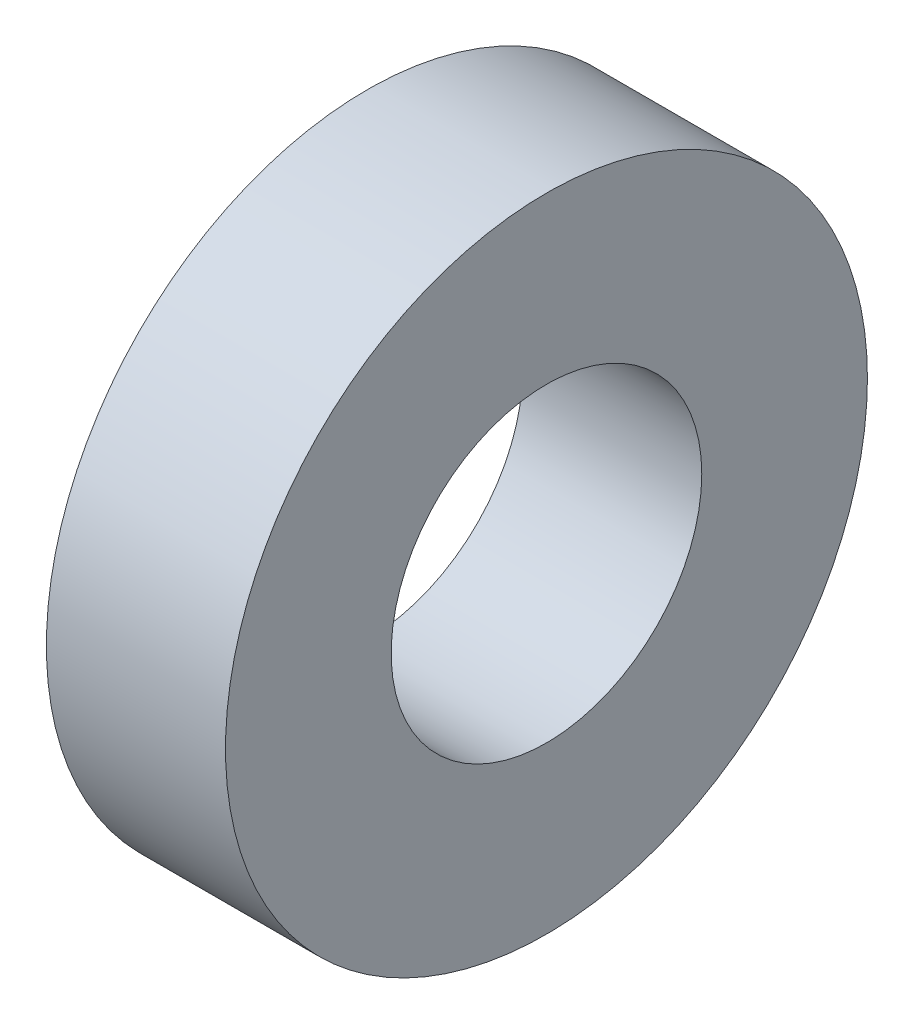
ISO-10303-21;
HEADER;
FILE_DESCRIPTION(('STEP AP214'),'2;1');
FILE_NAME('part.step','',(''),(''),'','','');
FILE_SCHEMA(('AUTOMOTIVE_DESIGN { 1 0 10303 214 1 1 1 1 }'));
ENDSEC;
DATA;
#1=APPLICATION_CONTEXT('core data for automotive mechanical design processes');
#2=APPLICATION_PROTOCOL_DEFINITION('international standard','automotive_design',2000,#1);
#3=PRODUCT_CONTEXT('',#1,'mechanical');
#4=PRODUCT('Part','Part','',(#3));
#5=PRODUCT_RELATED_PRODUCT_CATEGORY('part','',(#4));
#6=PRODUCT_DEFINITION_FORMATION('','',#4);
#7=PRODUCT_DEFINITION_CONTEXT('part definition',#1,'design');
#8=PRODUCT_DEFINITION('design','',#6,#7);
#9=PRODUCT_DEFINITION_SHAPE('','',#8);
#10=(LENGTH_UNIT() NAMED_UNIT(*) SI_UNIT(.MILLI.,.METRE.));
#11=(NAMED_UNIT(*) PLANE_ANGLE_UNIT() SI_UNIT($,.RADIAN.));
#12=(NAMED_UNIT(*) SI_UNIT($,.STERADIAN.) SOLID_ANGLE_UNIT());
#13=UNCERTAINTY_MEASURE_WITH_UNIT(LENGTH_MEASURE(1.E-05),#10,'distance_accuracy_value','');
#14=(GEOMETRIC_REPRESENTATION_CONTEXT(3) GLOBAL_UNCERTAINTY_ASSIGNED_CONTEXT((#13)) GLOBAL_UNIT_ASSIGNED_CONTEXT((#10,
#11,#12)) REPRESENTATION_CONTEXT('',''));
#15=CARTESIAN_POINT('',(0.,0.,0.));
#16=DIRECTION('',(0.,0.,1.));
#17=DIRECTION('',(1.,0.,0.));
#18=AXIS2_PLACEMENT_3D('',#15,#16,#17);
#19=CARTESIAN_POINT('',(17.3,0.,0.));
#20=DIRECTION('',(1.,0.,0.));
#21=DIRECTION('',(0.,0.,-1.));
#22=AXIS2_PLACEMENT_3D('',#19,#20,#21);
#23=PLANE('',#22);
#24=CARTESIAN_POINT('',(17.3,0.,0.));
#25=DIRECTION('',(1.,0.,0.));
#26=DIRECTION('',(0.,0.,-1.));
#27=AXIS2_PLACEMENT_3D('',#24,#25,#26);
#28=CIRCLE('',#27,31.);
#29=CARTESIAN_POINT('',(17.3,0.,-31.));
#30=VERTEX_POINT('',#29);
#31=EDGE_CURVE('E10',#30,#30,#28,.T.);
#32=ORIENTED_EDGE('',*,*,#31,.T.);
#33=EDGE_LOOP('',(#32));
#34=FACE_BOUND('',#33,.T.);
#35=CARTESIAN_POINT('',(17.3,0.,0.));
#36=DIRECTION('',(1.,0.,0.));
#37=DIRECTION('',(0.,0.,-1.));
#38=AXIS2_PLACEMENT_3D('',#35,#36,#37);
#39=CIRCLE('',#38,15.);
#40=CARTESIAN_POINT('',(17.3,0.,-15.));
#41=VERTEX_POINT('',#40);
#42=EDGE_CURVE('E45',#41,#41,#39,.T.);
#43=ORIENTED_EDGE('',*,*,#42,.F.);
#44=EDGE_LOOP('',(#43));
#45=FACE_BOUND('',#44,.T.);
#46=ADVANCED_FACE('F34',(#34,#45),#23,.T.);
#47=CARTESIAN_POINT('',(0.,0.,0.));
#48=DIRECTION('',(1.,0.,0.));
#49=DIRECTION('',(0.,0.,-1.));
#50=AXIS2_PLACEMENT_3D('',#47,#48,#49);
#51=PLANE('',#50);
#52=CARTESIAN_POINT('',(0.,0.,0.));
#53=DIRECTION('',(1.,0.,0.));
#54=DIRECTION('',(0.,0.,-1.));
#55=AXIS2_PLACEMENT_3D('',#52,#53,#54);
#56=CIRCLE('',#55,31.);
#57=CARTESIAN_POINT('',(0.,0.,-31.));
#58=VERTEX_POINT('',#57);
#59=EDGE_CURVE('E38',#58,#58,#56,.T.);
#60=ORIENTED_EDGE('',*,*,#59,.F.);
#61=EDGE_LOOP('',(#60));
#62=FACE_BOUND('',#61,.T.);
#63=CARTESIAN_POINT('',(0.,0.,0.));
#64=DIRECTION('',(1.,0.,0.));
#65=DIRECTION('',(0.,0.,-1.));
#66=AXIS2_PLACEMENT_3D('',#63,#64,#65);
#67=CIRCLE('',#66,15.);
#68=CARTESIAN_POINT('',(0.,0.,-15.));
#69=VERTEX_POINT('',#68);
#70=EDGE_CURVE('E47',#69,#69,#67,.T.);
#71=ORIENTED_EDGE('',*,*,#70,.T.);
#72=EDGE_LOOP('',(#71));
#73=FACE_BOUND('',#72,.T.);
#74=ADVANCED_FACE('F57',(#62,#73),#51,.F.);
#75=CARTESIAN_POINT('',(17.3,0.,0.));
#76=DIRECTION('',(-1.,0.,0.));
#77=DIRECTION('',(0.,0.,1.));
#78=AXIS2_PLACEMENT_3D('',#75,#76,#77);
#79=CYLINDRICAL_SURFACE('',#78,31.);
#80=ORIENTED_EDGE('',*,*,#31,.F.);
#81=EDGE_LOOP('',(#80));
#82=FACE_BOUND('',#81,.T.);
#83=ORIENTED_EDGE('',*,*,#59,.T.);
#84=EDGE_LOOP('',(#83));
#85=FACE_BOUND('',#84,.T.);
#86=ADVANCED_FACE('F36',(#82,#85),#79,.T.);
#87=CARTESIAN_POINT('',(17.3,0.,0.));
#88=DIRECTION('',(-1.,0.,0.));
#89=DIRECTION('',(0.,0.,1.));
#90=AXIS2_PLACEMENT_3D('',#87,#88,#89);
#91=CYLINDRICAL_SURFACE('',#90,15.);
#92=ORIENTED_EDGE('',*,*,#42,.T.);
#93=EDGE_LOOP('',(#92));
#94=FACE_BOUND('',#93,.T.);
#95=ORIENTED_EDGE('',*,*,#70,.F.);
#96=EDGE_LOOP('',(#95));
#97=FACE_BOUND('',#96,.T.);
#98=ADVANCED_FACE('F53',(#94,#97),#91,.F.);
#99=CLOSED_SHELL('',(#46,#74,#86,#98));
#100=MANIFOLD_SOLID_BREP('B2',#99);
#101=ADVANCED_BREP_SHAPE_REPRESENTATION('',(#18,#100),#14);
#102=SHAPE_DEFINITION_REPRESENTATION(#9,#101);
ENDSEC;
END-ISO-10303-21;
